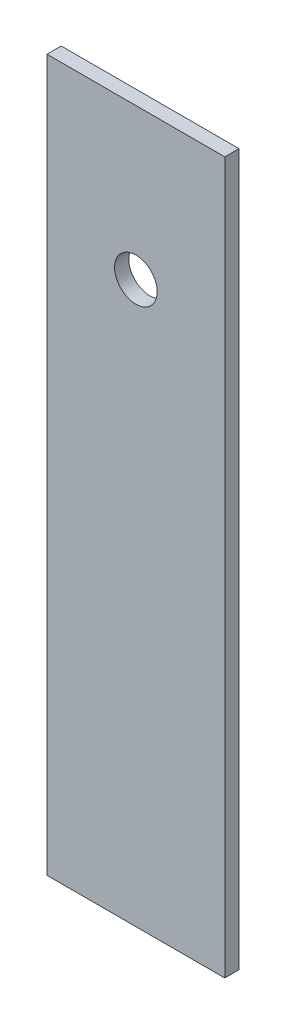
ISO-10303-21;
HEADER;
FILE_DESCRIPTION(('STEP AP214'),'2;1');
FILE_NAME('part.step','',(''),(''),'','','');
FILE_SCHEMA(('AUTOMOTIVE_DESIGN { 1 0 10303 214 1 1 1 1 }'));
ENDSEC;
DATA;
#1=APPLICATION_CONTEXT('core data for automotive mechanical design processes');
#2=APPLICATION_PROTOCOL_DEFINITION('international standard','automotive_design',2000,#1);
#3=PRODUCT_CONTEXT('',#1,'mechanical');
#4=PRODUCT('Part','Part','',(#3));
#5=PRODUCT_RELATED_PRODUCT_CATEGORY('part','',(#4));
#6=PRODUCT_DEFINITION_FORMATION('','',#4);
#7=PRODUCT_DEFINITION_CONTEXT('part definition',#1,'design');
#8=PRODUCT_DEFINITION('design','',#6,#7);
#9=PRODUCT_DEFINITION_SHAPE('','',#8);
#10=(LENGTH_UNIT() NAMED_UNIT(*) SI_UNIT(.MILLI.,.METRE.));
#11=(NAMED_UNIT(*) PLANE_ANGLE_UNIT() SI_UNIT($,.RADIAN.));
#12=(NAMED_UNIT(*) SI_UNIT($,.STERADIAN.) SOLID_ANGLE_UNIT());
#13=UNCERTAINTY_MEASURE_WITH_UNIT(LENGTH_MEASURE(1.E-05),#10,'distance_accuracy_value','');
#14=(GEOMETRIC_REPRESENTATION_CONTEXT(3) GLOBAL_UNCERTAINTY_ASSIGNED_CONTEXT((#13)) GLOBAL_UNIT_ASSIGNED_CONTEXT((#10,
#11,#12)) REPRESENTATION_CONTEXT('',''));
#15=CARTESIAN_POINT('',(0.,0.,0.));
#16=DIRECTION('',(0.,0.,1.));
#17=DIRECTION('',(1.,0.,0.));
#18=AXIS2_PLACEMENT_3D('',#15,#16,#17);
#19=CARTESIAN_POINT('',(0.,0.,2.));
#20=DIRECTION('',(0.,0.,1.));
#21=DIRECTION('',(1.,0.,0.));
#22=AXIS2_PLACEMENT_3D('',#19,#20,#21);
#23=PLANE('',#22);
#24=DIRECTION('',(0.,1.,0.));
#25=VECTOR('',#24,1.);
#26=CARTESIAN_POINT('',(12.5,50.,2.));
#27=LINE('',#26,#25);
#28=CARTESIAN_POINT('',(12.5,-50.,2.));
#29=VERTEX_POINT('',#28);
#30=CARTESIAN_POINT('',(12.5,50.,2.));
#31=VERTEX_POINT('',#30);
#32=EDGE_CURVE('E88',#29,#31,#27,.T.);
#33=ORIENTED_EDGE('',*,*,#32,.T.);
#34=DIRECTION('',(-1.,0.,0.));
#35=VECTOR('',#34,1.);
#36=CARTESIAN_POINT('',(-12.5,50.,2.));
#37=LINE('',#36,#35);
#38=CARTESIAN_POINT('',(-12.5,50.,2.));
#39=VERTEX_POINT('',#38);
#40=EDGE_CURVE('E83',#31,#39,#37,.T.);
#41=ORIENTED_EDGE('',*,*,#40,.T.);
#42=DIRECTION('',(0.,-1.,0.));
#43=VECTOR('',#42,1.);
#44=CARTESIAN_POINT('',(-12.5,50.,2.));
#45=LINE('',#44,#43);
#46=CARTESIAN_POINT('',(-12.5,-50.,2.));
#47=VERTEX_POINT('',#46);
#48=EDGE_CURVE('E86',#39,#47,#45,.T.);
#49=ORIENTED_EDGE('',*,*,#48,.T.);
#50=DIRECTION('',(1.,0.,0.));
#51=VECTOR('',#50,1.);
#52=CARTESIAN_POINT('',(-12.5,-50.,2.));
#53=LINE('',#52,#51);
#54=EDGE_CURVE('E53',#47,#29,#53,.T.);
#55=ORIENTED_EDGE('',*,*,#54,.T.);
#56=EDGE_LOOP('',(#33,#41,#49,#55));
#57=FACE_BOUND('',#56,.T.);
#58=CARTESIAN_POINT('',(0.,28.8,2.));
#59=DIRECTION('',(0.,0.,1.));
#60=DIRECTION('',(1.,0.,0.));
#61=AXIS2_PLACEMENT_3D('',#58,#59,#60);
#62=CIRCLE('',#61,3.);
#63=CARTESIAN_POINT('',(2.99999999999999,28.8,2.));
#64=VERTEX_POINT('',#63);
#65=EDGE_CURVE('E103',#64,#64,#62,.T.);
#66=ORIENTED_EDGE('',*,*,#65,.F.);
#67=EDGE_LOOP('',(#66));
#68=FACE_BOUND('',#67,.T.);
#69=ADVANCED_FACE('F36',(#57,#68),#23,.T.);
#70=CARTESIAN_POINT('',(0.,0.,0.));
#71=DIRECTION('',(0.,0.,1.));
#72=DIRECTION('',(1.,0.,0.));
#73=AXIS2_PLACEMENT_3D('',#70,#71,#72);
#74=PLANE('',#73);
#75=DIRECTION('',(0.,1.,0.));
#76=VECTOR('',#75,1.);
#77=CARTESIAN_POINT('',(12.5,50.,0.));
#78=LINE('',#77,#76);
#79=CARTESIAN_POINT('',(12.5,-50.,0.));
#80=VERTEX_POINT('',#79);
#81=CARTESIAN_POINT('',(12.5,50.,0.));
#82=VERTEX_POINT('',#81);
#83=EDGE_CURVE('E100',#80,#82,#78,.T.);
#84=ORIENTED_EDGE('',*,*,#83,.F.);
#85=DIRECTION('',(1.,0.,0.));
#86=VECTOR('',#85,1.);
#87=CARTESIAN_POINT('',(-12.5,-50.,0.));
#88=LINE('',#87,#86);
#89=CARTESIAN_POINT('',(-12.5,-50.,0.));
#90=VERTEX_POINT('',#89);
#91=EDGE_CURVE('E76',#90,#80,#88,.T.);
#92=ORIENTED_EDGE('',*,*,#91,.F.);
#93=DIRECTION('',(0.,-1.,0.));
#94=VECTOR('',#93,1.);
#95=CARTESIAN_POINT('',(-12.5,50.,0.));
#96=LINE('',#95,#94);
#97=CARTESIAN_POINT('',(-12.5,50.,0.));
#98=VERTEX_POINT('',#97);
#99=EDGE_CURVE('E70',#98,#90,#96,.T.);
#100=ORIENTED_EDGE('',*,*,#99,.F.);
#101=DIRECTION('',(-1.,0.,0.));
#102=VECTOR('',#101,1.);
#103=CARTESIAN_POINT('',(-12.5,50.,0.));
#104=LINE('',#103,#102);
#105=EDGE_CURVE('E92',#82,#98,#104,.T.);
#106=ORIENTED_EDGE('',*,*,#105,.F.);
#107=EDGE_LOOP('',(#84,#92,#100,#106));
#108=FACE_BOUND('',#107,.T.);
#109=CARTESIAN_POINT('',(0.,28.8,0.));
#110=DIRECTION('',(0.,0.,1.));
#111=DIRECTION('',(1.,0.,0.));
#112=AXIS2_PLACEMENT_3D('',#109,#110,#111);
#113=CIRCLE('',#112,3.);
#114=CARTESIAN_POINT('',(2.99999999999999,28.8,0.));
#115=VERTEX_POINT('',#114);
#116=EDGE_CURVE('E115',#115,#115,#113,.T.);
#117=ORIENTED_EDGE('',*,*,#116,.T.);
#118=EDGE_LOOP('',(#117));
#119=FACE_BOUND('',#118,.T.);
#120=ADVANCED_FACE('F111',(#108,#119),#74,.F.);
#121=CARTESIAN_POINT('',(12.5,50.,2.));
#122=DIRECTION('',(-1.,0.,0.));
#123=DIRECTION('',(0.,-1.,0.));
#124=AXIS2_PLACEMENT_3D('',#121,#122,#123);
#125=PLANE('',#124);
#126=ORIENTED_EDGE('',*,*,#83,.T.);
#127=DIRECTION('',(0.,0.,-1.));
#128=VECTOR('',#127,1.);
#129=CARTESIAN_POINT('',(12.5,50.,2.));
#130=LINE('',#129,#128);
#131=EDGE_CURVE('E11',#31,#82,#130,.T.);
#132=ORIENTED_EDGE('',*,*,#131,.F.);
#133=ORIENTED_EDGE('',*,*,#32,.F.);
#134=DIRECTION('',(0.,0.,-1.));
#135=VECTOR('',#134,1.);
#136=CARTESIAN_POINT('',(12.5,-50.,2.));
#137=LINE('',#136,#135);
#138=EDGE_CURVE('E96',#29,#80,#137,.T.);
#139=ORIENTED_EDGE('',*,*,#138,.T.);
#140=EDGE_LOOP('',(#126,#132,#133,#139));
#141=FACE_BOUND('',#140,.T.);
#142=ADVANCED_FACE('F38',(#141),#125,.F.);
#143=CARTESIAN_POINT('',(-12.5,50.,2.));
#144=DIRECTION('',(0.,-1.,0.));
#145=DIRECTION('',(0.,0.,-1.));
#146=AXIS2_PLACEMENT_3D('',#143,#144,#145);
#147=PLANE('',#146);
#148=ORIENTED_EDGE('',*,*,#105,.T.);
#149=DIRECTION('',(0.,0.,-1.));
#150=VECTOR('',#149,1.);
#151=CARTESIAN_POINT('',(-12.5,50.,2.));
#152=LINE('',#151,#150);
#153=EDGE_CURVE('E45',#39,#98,#152,.T.);
#154=ORIENTED_EDGE('',*,*,#153,.F.);
#155=ORIENTED_EDGE('',*,*,#40,.F.);
#156=ORIENTED_EDGE('',*,*,#131,.T.);
#157=EDGE_LOOP('',(#148,#154,#155,#156));
#158=FACE_BOUND('',#157,.T.);
#159=ADVANCED_FACE('F91',(#158),#147,.F.);
#160=CARTESIAN_POINT('',(-12.5,50.,2.));
#161=DIRECTION('',(1.,0.,0.));
#162=DIRECTION('',(0.,1.,0.));
#163=AXIS2_PLACEMENT_3D('',#160,#161,#162);
#164=PLANE('',#163);
#165=ORIENTED_EDGE('',*,*,#99,.T.);
#166=DIRECTION('',(0.,0.,-1.));
#167=VECTOR('',#166,1.);
#168=CARTESIAN_POINT('',(-12.5,-50.,2.));
#169=LINE('',#168,#167);
#170=EDGE_CURVE('E93',#47,#90,#169,.T.);
#171=ORIENTED_EDGE('',*,*,#170,.F.);
#172=ORIENTED_EDGE('',*,*,#48,.F.);
#173=ORIENTED_EDGE('',*,*,#153,.T.);
#174=EDGE_LOOP('',(#165,#171,#172,#173));
#175=FACE_BOUND('',#174,.T.);
#176=ADVANCED_FACE('F94',(#175),#164,.F.);
#177=CARTESIAN_POINT('',(-12.5,-50.,2.));
#178=DIRECTION('',(0.,1.,0.));
#179=DIRECTION('',(0.,0.,1.));
#180=AXIS2_PLACEMENT_3D('',#177,#178,#179);
#181=PLANE('',#180);
#182=ORIENTED_EDGE('',*,*,#91,.T.);
#183=ORIENTED_EDGE('',*,*,#138,.F.);
#184=ORIENTED_EDGE('',*,*,#54,.F.);
#185=ORIENTED_EDGE('',*,*,#170,.T.);
#186=EDGE_LOOP('',(#182,#183,#184,#185));
#187=FACE_BOUND('',#186,.T.);
#188=ADVANCED_FACE('F108',(#187),#181,.F.);
#189=CARTESIAN_POINT('',(0.,28.8,2.));
#190=DIRECTION('',(0.,0.,-1.));
#191=DIRECTION('',(-1.,0.,0.));
#192=AXIS2_PLACEMENT_3D('',#189,#190,#191);
#193=CYLINDRICAL_SURFACE('',#192,3.);
#194=ORIENTED_EDGE('',*,*,#65,.T.);
#195=EDGE_LOOP('',(#194));
#196=FACE_BOUND('',#195,.T.);
#197=ORIENTED_EDGE('',*,*,#116,.F.);
#198=EDGE_LOOP('',(#197));
#199=FACE_BOUND('',#198,.T.);
#200=ADVANCED_FACE('F121',(#196,#199),#193,.F.);
#201=CLOSED_SHELL('',(#69,#120,#142,#159,#176,#188,#200));
#202=MANIFOLD_SOLID_BREP('B2',#201);
#203=ADVANCED_BREP_SHAPE_REPRESENTATION('',(#18,#202),#14);
#204=SHAPE_DEFINITION_REPRESENTATION(#9,#203);
ENDSEC;
END-ISO-10303-21;
